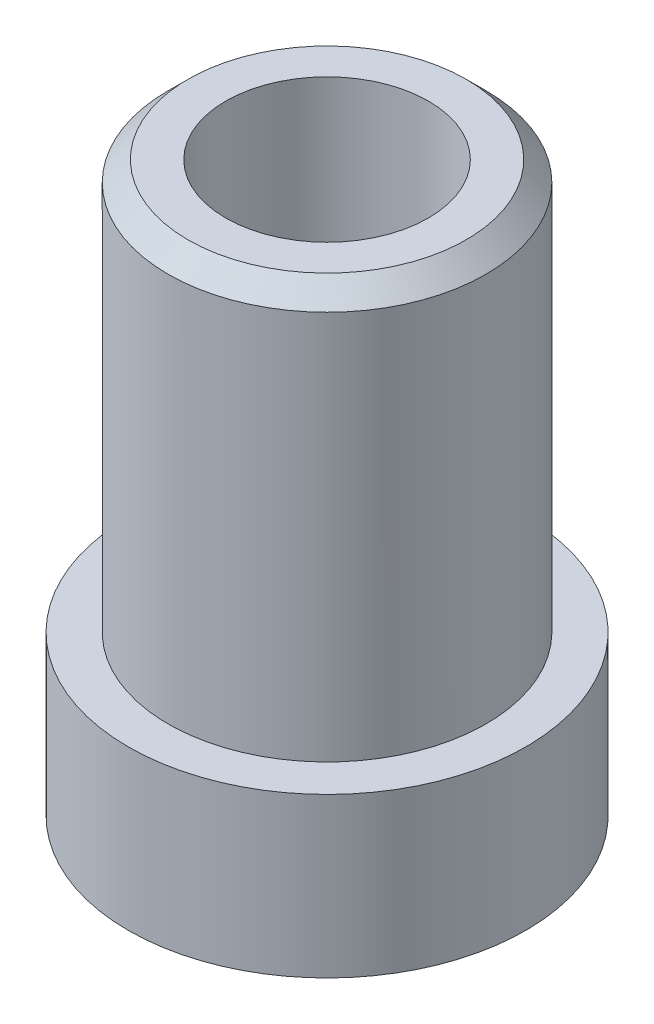
ISO-10303-21;
HEADER;
FILE_DESCRIPTION(('STEP AP214'),'2;1');
FILE_NAME('part.step','',(''),(''),'','','');
FILE_SCHEMA(('AUTOMOTIVE_DESIGN { 1 0 10303 214 1 1 1 1 }'));
ENDSEC;
DATA;
#1=APPLICATION_CONTEXT('core data for automotive mechanical design processes');
#2=APPLICATION_PROTOCOL_DEFINITION('international standard','automotive_design',2000,#1);
#3=PRODUCT_CONTEXT('',#1,'mechanical');
#4=PRODUCT('Part','Part','',(#3));
#5=PRODUCT_RELATED_PRODUCT_CATEGORY('part','',(#4));
#6=PRODUCT_DEFINITION_FORMATION('','',#4);
#7=PRODUCT_DEFINITION_CONTEXT('part definition',#1,'design');
#8=PRODUCT_DEFINITION('design','',#6,#7);
#9=PRODUCT_DEFINITION_SHAPE('','',#8);
#10=(LENGTH_UNIT() NAMED_UNIT(*) SI_UNIT(.MILLI.,.METRE.));
#11=(NAMED_UNIT(*) PLANE_ANGLE_UNIT() SI_UNIT($,.RADIAN.));
#12=(NAMED_UNIT(*) SI_UNIT($,.STERADIAN.) SOLID_ANGLE_UNIT());
#13=UNCERTAINTY_MEASURE_WITH_UNIT(LENGTH_MEASURE(1.E-05),#10,'distance_accuracy_value','');
#14=(GEOMETRIC_REPRESENTATION_CONTEXT(3) GLOBAL_UNCERTAINTY_ASSIGNED_CONTEXT((#13)) GLOBAL_UNIT_ASSIGNED_CONTEXT((#10,
#11,#12)) REPRESENTATION_CONTEXT('',''));
#15=CARTESIAN_POINT('',(0.,0.,0.));
#16=DIRECTION('',(0.,0.,1.));
#17=DIRECTION('',(1.,0.,0.));
#18=AXIS2_PLACEMENT_3D('',#15,#16,#17);
#19=CARTESIAN_POINT('',(0.,7.15,0.));
#20=DIRECTION('',(0.,-1.,0.));
#21=DIRECTION('',(0.,0.,-1.));
#22=AXIS2_PLACEMENT_3D('',#19,#20,#21);
#23=CYLINDRICAL_SURFACE('',#22,4.);
#24=CARTESIAN_POINT('',(0.,6.65,0.));
#25=DIRECTION('',(0.,1.,0.));
#26=DIRECTION('',(0.,0.,1.));
#27=AXIS2_PLACEMENT_3D('',#24,#25,#26);
#28=CIRCLE('',#27,4.);
#29=CARTESIAN_POINT('',(0.,6.65,4.));
#30=VERTEX_POINT('',#29);
#31=EDGE_CURVE('E10',#30,#30,#28,.F.);
#32=ORIENTED_EDGE('',*,*,#31,.T.);
#33=EDGE_LOOP('',(#32));
#34=FACE_BOUND('',#33,.T.);
#35=CARTESIAN_POINT('',(0.,-3.15,0.));
#36=DIRECTION('',(0.,-1.,0.));
#37=DIRECTION('',(0.,0.,-1.));
#38=AXIS2_PLACEMENT_3D('',#35,#36,#37);
#39=CIRCLE('',#38,4.);
#40=CARTESIAN_POINT('',(0.,-3.15,-4.));
#41=VERTEX_POINT('',#40);
#42=EDGE_CURVE('E45',#41,#41,#39,.T.);
#43=ORIENTED_EDGE('',*,*,#42,.F.);
#44=EDGE_LOOP('',(#43));
#45=FACE_BOUND('',#44,.T.);
#46=ADVANCED_FACE('F34',(#34,#45),#23,.T.);
#47=CARTESIAN_POINT('',(0.,7.15,0.));
#48=DIRECTION('',(0.,1.,0.));
#49=DIRECTION('',(0.,0.,1.));
#50=AXIS2_PLACEMENT_3D('',#47,#48,#49);
#51=PLANE('',#50);
#52=CARTESIAN_POINT('',(0.,7.15,0.));
#53=DIRECTION('',(0.,-1.,0.));
#54=DIRECTION('',(0.,0.,-1.));
#55=AXIS2_PLACEMENT_3D('',#52,#53,#54);
#56=CIRCLE('',#55,2.55);
#57=CARTESIAN_POINT('',(0.,7.15,-2.55));
#58=VERTEX_POINT('',#57);
#59=EDGE_CURVE('E57',#58,#58,#56,.T.);
#60=ORIENTED_EDGE('',*,*,#59,.T.);
#61=EDGE_LOOP('',(#60));
#62=FACE_BOUND('',#61,.T.);
#63=CARTESIAN_POINT('',(0.,7.15,0.));
#64=DIRECTION('',(0.,1.,0.));
#65=DIRECTION('',(0.,0.,1.));
#66=AXIS2_PLACEMENT_3D('',#63,#64,#65);
#67=CIRCLE('',#66,3.5);
#68=CARTESIAN_POINT('',(0.,7.15,3.5));
#69=VERTEX_POINT('',#68);
#70=EDGE_CURVE('E41',#69,#69,#67,.T.);
#71=ORIENTED_EDGE('',*,*,#70,.T.);
#72=EDGE_LOOP('',(#71));
#73=FACE_BOUND('',#72,.T.);
#74=ADVANCED_FACE('F75',(#62,#73),#51,.T.);
#75=CARTESIAN_POINT('',(0.,7.15,0.));
#76=DIRECTION('',(0.,1.,0.));
#77=DIRECTION('',(0.,0.,1.));
#78=AXIS2_PLACEMENT_3D('',#75,#76,#77);
#79=CYLINDRICAL_SURFACE('',#78,5.);
#80=CARTESIAN_POINT('',(0.,-3.15,0.));
#81=DIRECTION('',(0.,1.,0.));
#82=DIRECTION('',(0.,0.,1.));
#83=AXIS2_PLACEMENT_3D('',#80,#81,#82);
#84=CIRCLE('',#83,5.);
#85=CARTESIAN_POINT('',(0.,-3.15,5.));
#86=VERTEX_POINT('',#85);
#87=EDGE_CURVE('E54',#86,#86,#84,.T.);
#88=ORIENTED_EDGE('',*,*,#87,.F.);
#89=EDGE_LOOP('',(#88));
#90=FACE_BOUND('',#89,.T.);
#91=CARTESIAN_POINT('',(0.,-7.15,0.));
#92=DIRECTION('',(0.,1.,0.));
#93=DIRECTION('',(0.,0.,1.));
#94=AXIS2_PLACEMENT_3D('',#91,#92,#93);
#95=CIRCLE('',#94,5.);
#96=CARTESIAN_POINT('',(0.,-7.15,5.));
#97=VERTEX_POINT('',#96);
#98=EDGE_CURVE('E49',#97,#97,#95,.T.);
#99=ORIENTED_EDGE('',*,*,#98,.T.);
#100=EDGE_LOOP('',(#99));
#101=FACE_BOUND('',#100,.T.);
#102=ADVANCED_FACE('F73',(#90,#101),#79,.T.);
#103=CARTESIAN_POINT('',(5.,-3.15,0.));
#104=DIRECTION('',(0.,-1.,0.));
#105=DIRECTION('',(0.,0.,-1.));
#106=AXIS2_PLACEMENT_3D('',#103,#104,#105);
#107=PLANE('',#106);
#108=ORIENTED_EDGE('',*,*,#42,.T.);
#109=EDGE_LOOP('',(#108));
#110=FACE_BOUND('',#109,.T.);
#111=ORIENTED_EDGE('',*,*,#87,.T.);
#112=EDGE_LOOP('',(#111));
#113=FACE_BOUND('',#112,.T.);
#114=ADVANCED_FACE('F69',(#110,#113),#107,.F.);
#115=CARTESIAN_POINT('',(0.,-7.15,0.));
#116=DIRECTION('',(0.,1.,0.));
#117=DIRECTION('',(0.,0.,1.));
#118=AXIS2_PLACEMENT_3D('',#115,#116,#117);
#119=PLANE('',#118);
#120=CARTESIAN_POINT('',(0.,-7.15,0.));
#121=DIRECTION('',(0.,-1.,0.));
#122=DIRECTION('',(0.,0.,-1.));
#123=AXIS2_PLACEMENT_3D('',#120,#121,#122);
#124=CIRCLE('',#123,2.55);
#125=CARTESIAN_POINT('',(0.,-7.15,-2.55));
#126=VERTEX_POINT('',#125);
#127=EDGE_CURVE('E60',#126,#126,#124,.T.);
#128=ORIENTED_EDGE('',*,*,#127,.F.);
#129=EDGE_LOOP('',(#128));
#130=FACE_BOUND('',#129,.T.);
#131=ORIENTED_EDGE('',*,*,#98,.F.);
#132=EDGE_LOOP('',(#131));
#133=FACE_BOUND('',#132,.T.);
#134=ADVANCED_FACE('F66',(#130,#133),#119,.F.);
#135=CARTESIAN_POINT('',(0.,7.15,0.));
#136=DIRECTION('',(0.,-1.,0.));
#137=DIRECTION('',(0.,0.,-1.));
#138=AXIS2_PLACEMENT_3D('',#135,#136,#137);
#139=CONICAL_SURFACE('',#138,3.5,0.785398163397445);
#140=ORIENTED_EDGE('',*,*,#31,.F.);
#141=EDGE_LOOP('',(#140));
#142=FACE_BOUND('',#141,.T.);
#143=ORIENTED_EDGE('',*,*,#70,.F.);
#144=EDGE_LOOP('',(#143));
#145=FACE_BOUND('',#144,.T.);
#146=ADVANCED_FACE('F36',(#142,#145),#139,.T.);
#147=CARTESIAN_POINT('',(0.,-7.15,0.));
#148=DIRECTION('',(0.,-1.,0.));
#149=DIRECTION('',(0.,0.,-1.));
#150=AXIS2_PLACEMENT_3D('',#147,#148,#149);
#151=CYLINDRICAL_SURFACE('',#150,2.55);
#152=ORIENTED_EDGE('',*,*,#59,.F.);
#153=EDGE_LOOP('',(#152));
#154=FACE_BOUND('',#153,.T.);
#155=ORIENTED_EDGE('',*,*,#127,.T.);
#156=EDGE_LOOP('',(#155));
#157=FACE_BOUND('',#156,.T.);
#158=ADVANCED_FACE('F64',(#154,#157),#151,.F.);
#159=CLOSED_SHELL('',(#46,#74,#102,#114,#134,#146,#158));
#160=MANIFOLD_SOLID_BREP('B2',#159);
#161=ADVANCED_BREP_SHAPE_REPRESENTATION('',(#18,#160),#14);
#162=SHAPE_DEFINITION_REPRESENTATION(#9,#161);
ENDSEC;
END-ISO-10303-21;
